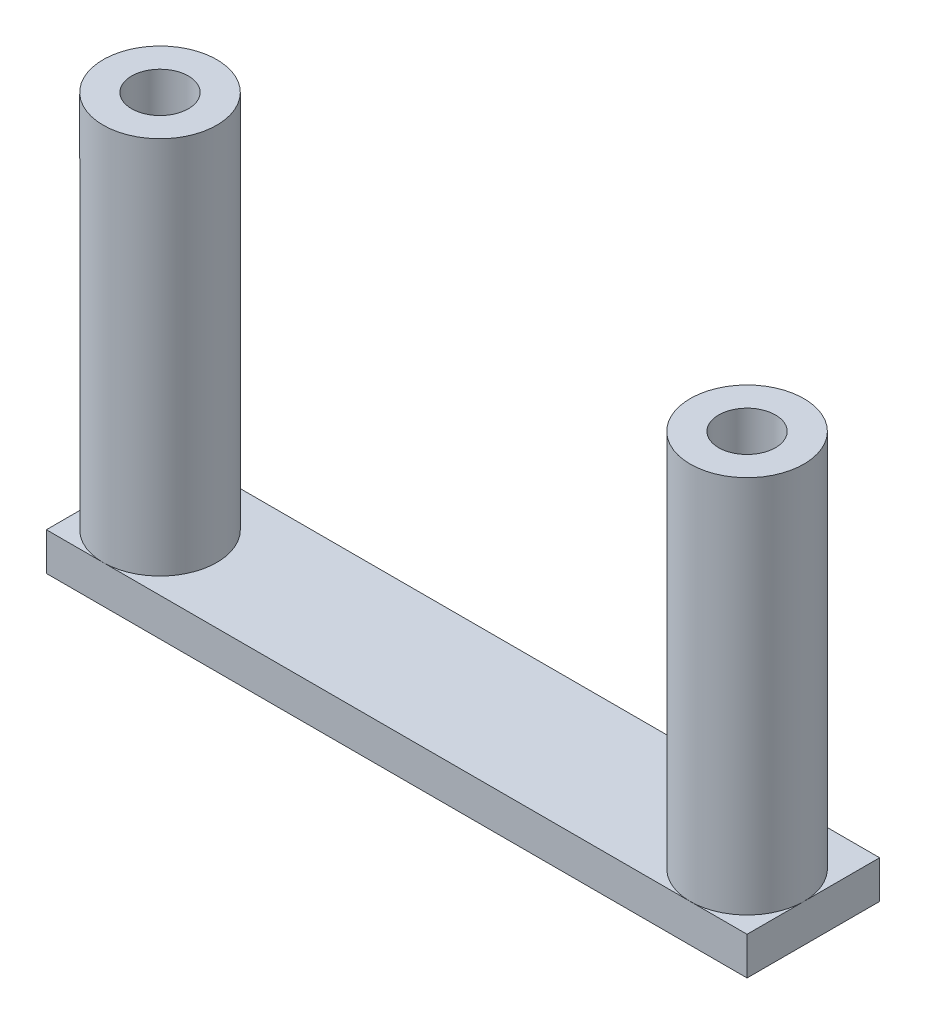
ISO-10303-21;
HEADER;
FILE_DESCRIPTION(('STEP AP214'),'2;1');
FILE_NAME('part.step','',(''),(''),'','','');
FILE_SCHEMA(('AUTOMOTIVE_DESIGN { 1 0 10303 214 1 1 1 1 }'));
ENDSEC;
DATA;
#1=APPLICATION_CONTEXT('core data for automotive mechanical design processes');
#2=APPLICATION_PROTOCOL_DEFINITION('international standard','automotive_design',2000,#1);
#3=PRODUCT_CONTEXT('',#1,'mechanical');
#4=PRODUCT('Part','Part','',(#3));
#5=PRODUCT_RELATED_PRODUCT_CATEGORY('part','',(#4));
#6=PRODUCT_DEFINITION_FORMATION('','',#4);
#7=PRODUCT_DEFINITION_CONTEXT('part definition',#1,'design');
#8=PRODUCT_DEFINITION('design','',#6,#7);
#9=PRODUCT_DEFINITION_SHAPE('','',#8);
#10=(LENGTH_UNIT() NAMED_UNIT(*) SI_UNIT(.MILLI.,.METRE.));
#11=(NAMED_UNIT(*) PLANE_ANGLE_UNIT() SI_UNIT($,.RADIAN.));
#12=(NAMED_UNIT(*) SI_UNIT($,.STERADIAN.) SOLID_ANGLE_UNIT());
#13=UNCERTAINTY_MEASURE_WITH_UNIT(LENGTH_MEASURE(1.E-05),#10,'distance_accuracy_value','');
#14=(GEOMETRIC_REPRESENTATION_CONTEXT(3) GLOBAL_UNCERTAINTY_ASSIGNED_CONTEXT((#13)) GLOBAL_UNIT_ASSIGNED_CONTEXT((#10,
#11,#12)) REPRESENTATION_CONTEXT('',''));
#15=CARTESIAN_POINT('',(0.,0.,0.));
#16=DIRECTION('',(0.,0.,1.));
#17=DIRECTION('',(1.,0.,0.));
#18=AXIS2_PLACEMENT_3D('',#15,#16,#17);
#19=CARTESIAN_POINT('',(0.,2.,0.));
#20=DIRECTION('',(0.,1.,0.));
#21=DIRECTION('',(0.,0.,1.));
#22=AXIS2_PLACEMENT_3D('',#19,#20,#21);
#23=PLANE('',#22);
#24=DIRECTION('',(1.,0.,0.));
#25=VECTOR('',#24,1.);
#26=CARTESIAN_POINT('',(0.,2.,3.));
#27=LINE('',#26,#25);
#28=CARTESIAN_POINT('',(-3.,2.,3.));
#29=VERTEX_POINT('',#28);
#30=CARTESIAN_POINT('',(0.,2.,3.));
#31=VERTEX_POINT('',#30);
#32=EDGE_CURVE('E129',#29,#31,#27,.T.);
#33=ORIENTED_EDGE('',*,*,#32,.T.);
#34=CARTESIAN_POINT('',(0.,2.,0.));
#35=DIRECTION('',(0.,1.,0.));
#36=DIRECTION('',(0.,0.,1.));
#37=AXIS2_PLACEMENT_3D('',#34,#35,#36);
#38=CIRCLE('',#37,3.);
#39=CARTESIAN_POINT('',(-3.,2.,0.));
#40=VERTEX_POINT('',#39);
#41=EDGE_CURVE('E59',#40,#31,#38,.T.);
#42=ORIENTED_EDGE('',*,*,#41,.F.);
#43=DIRECTION('',(0.,0.,-1.));
#44=VECTOR('',#43,1.);
#45=CARTESIAN_POINT('',(-3.,2.,0.));
#46=LINE('',#45,#44);
#47=EDGE_CURVE('E146',#29,#40,#46,.T.);
#48=ORIENTED_EDGE('',*,*,#47,.F.);
#49=EDGE_LOOP('',(#33,#42,#48));
#50=FACE_BOUND('',#49,.T.);
#51=ADVANCED_FACE('F37',(#50),#23,.T.);
#52=DIRECTION('',(1.,0.,0.));
#53=VECTOR('',#52,1.);
#54=CARTESIAN_POINT('',(0.,2.,-4.));
#55=LINE('',#54,#53);
#56=CARTESIAN_POINT('',(-3.,2.,-4.));
#57=VERTEX_POINT('',#56);
#58=CARTESIAN_POINT('',(34.,2.,-4.));
#59=VERTEX_POINT('',#58);
#60=EDGE_CURVE('E103',#57,#59,#55,.T.);
#61=ORIENTED_EDGE('',*,*,#60,.F.);
#62=EDGE_CURVE('E102',#40,#57,#46,.T.);
#63=ORIENTED_EDGE('',*,*,#62,.F.);
#64=EDGE_CURVE('E162',#31,#40,#38,.T.);
#65=ORIENTED_EDGE('',*,*,#64,.F.);
#66=CARTESIAN_POINT('',(31.,2.,3.));
#67=VERTEX_POINT('',#66);
#68=EDGE_CURVE('E149',#31,#67,#27,.T.);
#69=ORIENTED_EDGE('',*,*,#68,.T.);
#70=CARTESIAN_POINT('',(31.,2.,0.));
#71=DIRECTION('',(0.,1.,0.));
#72=DIRECTION('',(0.,0.,1.));
#73=AXIS2_PLACEMENT_3D('',#70,#71,#72);
#74=CIRCLE('',#73,3.);
#75=CARTESIAN_POINT('',(34.,2.,0.));
#76=VERTEX_POINT('',#75);
#77=EDGE_CURVE('E141',#76,#67,#74,.T.);
#78=ORIENTED_EDGE('',*,*,#77,.F.);
#79=DIRECTION('',(0.,0.,-1.));
#80=VECTOR('',#79,1.);
#81=CARTESIAN_POINT('',(34.,2.,0.));
#82=LINE('',#81,#80);
#83=EDGE_CURVE('E124',#76,#59,#82,.T.);
#84=ORIENTED_EDGE('',*,*,#83,.T.);
#85=EDGE_LOOP('',(#61,#63,#65,#69,#78,#84));
#86=FACE_BOUND('',#85,.T.);
#87=ADVANCED_FACE('F160',(#86),#23,.T.);
#88=CARTESIAN_POINT('',(34.,2.,3.));
#89=VERTEX_POINT('',#88);
#90=EDGE_CURVE('E119',#89,#76,#82,.T.);
#91=ORIENTED_EDGE('',*,*,#90,.T.);
#92=EDGE_CURVE('E137',#67,#76,#74,.T.);
#93=ORIENTED_EDGE('',*,*,#92,.F.);
#94=EDGE_CURVE('E147',#67,#89,#27,.T.);
#95=ORIENTED_EDGE('',*,*,#94,.T.);
#96=EDGE_LOOP('',(#91,#93,#95));
#97=FACE_BOUND('',#96,.T.);
#98=ADVANCED_FACE('F165',(#97),#23,.T.);
#99=CARTESIAN_POINT('',(-3.,2.,0.));
#100=DIRECTION('',(-1.,0.,0.));
#101=DIRECTION('',(0.,0.,1.));
#102=AXIS2_PLACEMENT_3D('',#99,#100,#101);
#103=PLANE('',#102);
#104=DIRECTION('',(0.,-1.,0.));
#105=VECTOR('',#104,1.);
#106=CARTESIAN_POINT('',(-3.,22.,-4.));
#107=LINE('',#106,#105);
#108=CARTESIAN_POINT('',(-3.,0.,-4.));
#109=VERTEX_POINT('',#108);
#110=EDGE_CURVE('E89',#57,#109,#107,.T.);
#111=ORIENTED_EDGE('',*,*,#110,.T.);
#112=DIRECTION('',(0.,0.,-1.));
#113=VECTOR('',#112,1.);
#114=CARTESIAN_POINT('',(-3.,0.,0.));
#115=LINE('',#114,#113);
#116=CARTESIAN_POINT('',(-3.,0.,3.));
#117=VERTEX_POINT('',#116);
#118=EDGE_CURVE('E99',#117,#109,#115,.T.);
#119=ORIENTED_EDGE('',*,*,#118,.F.);
#120=DIRECTION('',(0.,-1.,0.));
#121=VECTOR('',#120,1.);
#122=CARTESIAN_POINT('',(-3.,2.,3.));
#123=LINE('',#122,#121);
#124=EDGE_CURVE('E11',#29,#117,#123,.T.);
#125=ORIENTED_EDGE('',*,*,#124,.F.);
#126=ORIENTED_EDGE('',*,*,#47,.T.);
#127=ORIENTED_EDGE('',*,*,#62,.T.);
#128=EDGE_LOOP('',(#111,#119,#125,#126,#127));
#129=FACE_BOUND('',#128,.T.);
#130=ADVANCED_FACE('F98',(#129),#103,.T.);
#131=CARTESIAN_POINT('',(0.,2.,3.));
#132=DIRECTION('',(0.,0.,-1.));
#133=DIRECTION('',(-1.,0.,0.));
#134=AXIS2_PLACEMENT_3D('',#131,#132,#133);
#135=PLANE('',#134);
#136=DIRECTION('',(1.,0.,0.));
#137=VECTOR('',#136,1.);
#138=CARTESIAN_POINT('',(0.,0.,3.));
#139=LINE('',#138,#137);
#140=CARTESIAN_POINT('',(34.,0.,3.));
#141=VERTEX_POINT('',#140);
#142=EDGE_CURVE('E108',#117,#141,#139,.T.);
#143=ORIENTED_EDGE('',*,*,#142,.T.);
#144=DIRECTION('',(0.,-1.,0.));
#145=VECTOR('',#144,1.);
#146=CARTESIAN_POINT('',(34.,2.,3.));
#147=LINE('',#146,#145);
#148=EDGE_CURVE('E45',#89,#141,#147,.T.);
#149=ORIENTED_EDGE('',*,*,#148,.F.);
#150=ORIENTED_EDGE('',*,*,#94,.F.);
#151=ORIENTED_EDGE('',*,*,#68,.F.);
#152=ORIENTED_EDGE('',*,*,#32,.F.);
#153=ORIENTED_EDGE('',*,*,#124,.T.);
#154=EDGE_LOOP('',(#143,#149,#150,#151,#152,#153));
#155=FACE_BOUND('',#154,.T.);
#156=ADVANCED_FACE('F156',(#155),#135,.F.);
#157=CARTESIAN_POINT('',(34.,2.,0.));
#158=DIRECTION('',(-1.,0.,0.));
#159=DIRECTION('',(0.,0.,1.));
#160=AXIS2_PLACEMENT_3D('',#157,#158,#159);
#161=PLANE('',#160);
#162=DIRECTION('',(0.,0.,-1.));
#163=VECTOR('',#162,1.);
#164=CARTESIAN_POINT('',(34.,0.,0.));
#165=LINE('',#164,#163);
#166=CARTESIAN_POINT('',(34.,0.,-4.));
#167=VERTEX_POINT('',#166);
#168=EDGE_CURVE('E111',#141,#167,#165,.T.);
#169=ORIENTED_EDGE('',*,*,#168,.T.);
#170=DIRECTION('',(0.,-1.,0.));
#171=VECTOR('',#170,1.);
#172=CARTESIAN_POINT('',(34.,22.,-4.));
#173=LINE('',#172,#171);
#174=EDGE_CURVE('E52',#59,#167,#173,.T.);
#175=ORIENTED_EDGE('',*,*,#174,.F.);
#176=ORIENTED_EDGE('',*,*,#83,.F.);
#177=ORIENTED_EDGE('',*,*,#90,.F.);
#178=ORIENTED_EDGE('',*,*,#148,.T.);
#179=EDGE_LOOP('',(#169,#175,#176,#177,#178));
#180=FACE_BOUND('',#179,.T.);
#181=ADVANCED_FACE('F203',(#180),#161,.F.);
#182=CARTESIAN_POINT('',(31.,2.,0.));
#183=DIRECTION('',(0.,-1.,0.));
#184=DIRECTION('',(0.,0.,-1.));
#185=AXIS2_PLACEMENT_3D('',#182,#183,#184);
#186=CYLINDRICAL_SURFACE('',#185,1.5);
#187=CARTESIAN_POINT('',(31.,0.,0.));
#188=DIRECTION('',(0.,1.,0.));
#189=DIRECTION('',(0.,0.,1.));
#190=AXIS2_PLACEMENT_3D('',#187,#188,#189);
#191=CIRCLE('',#190,1.5);
#192=CARTESIAN_POINT('',(31.,0.,1.5));
#193=VERTEX_POINT('',#192);
#194=EDGE_CURVE('E109',#193,#193,#191,.T.);
#195=ORIENTED_EDGE('',*,*,#194,.F.);
#196=EDGE_LOOP('',(#195));
#197=FACE_BOUND('',#196,.T.);
#198=CARTESIAN_POINT('',(31.,22.,0.));
#199=DIRECTION('',(0.,1.,0.));
#200=DIRECTION('',(0.,0.,1.));
#201=AXIS2_PLACEMENT_3D('',#198,#199,#200);
#202=CIRCLE('',#201,1.5);
#203=CARTESIAN_POINT('',(31.,22.,1.5));
#204=VERTEX_POINT('',#203);
#205=EDGE_CURVE('E144',#204,#204,#202,.T.);
#206=ORIENTED_EDGE('',*,*,#205,.T.);
#207=EDGE_LOOP('',(#206));
#208=FACE_BOUND('',#207,.T.);
#209=ADVANCED_FACE('F208',(#197,#208),#186,.F.);
#210=CARTESIAN_POINT('',(0.,2.,0.));
#211=DIRECTION('',(0.,-1.,0.));
#212=DIRECTION('',(0.,0.,-1.));
#213=AXIS2_PLACEMENT_3D('',#210,#211,#212);
#214=CYLINDRICAL_SURFACE('',#213,1.5);
#215=CARTESIAN_POINT('',(0.,0.,0.));
#216=DIRECTION('',(0.,1.,0.));
#217=DIRECTION('',(0.,0.,1.));
#218=AXIS2_PLACEMENT_3D('',#215,#216,#217);
#219=CIRCLE('',#218,1.5);
#220=CARTESIAN_POINT('',(0.,0.,1.5));
#221=VERTEX_POINT('',#220);
#222=EDGE_CURVE('E114',#221,#221,#219,.T.);
#223=ORIENTED_EDGE('',*,*,#222,.F.);
#224=EDGE_LOOP('',(#223));
#225=FACE_BOUND('',#224,.T.);
#226=CARTESIAN_POINT('',(0.,22.,0.));
#227=DIRECTION('',(0.,1.,0.));
#228=DIRECTION('',(0.,0.,1.));
#229=AXIS2_PLACEMENT_3D('',#226,#227,#228);
#230=CIRCLE('',#229,1.5);
#231=CARTESIAN_POINT('',(0.,22.,1.5));
#232=VERTEX_POINT('',#231);
#233=EDGE_CURVE('E306',#232,#232,#230,.T.);
#234=ORIENTED_EDGE('',*,*,#233,.T.);
#235=EDGE_LOOP('',(#234));
#236=FACE_BOUND('',#235,.T.);
#237=ADVANCED_FACE('F39',(#225,#236),#214,.F.);
#238=CARTESIAN_POINT('',(0.,0.,0.));
#239=DIRECTION('',(0.,1.,0.));
#240=DIRECTION('',(0.,0.,1.));
#241=AXIS2_PLACEMENT_3D('',#238,#239,#240);
#242=PLANE('',#241);
#243=ORIENTED_EDGE('',*,*,#222,.T.);
#244=EDGE_LOOP('',(#243));
#245=FACE_BOUND('',#244,.T.);
#246=ORIENTED_EDGE('',*,*,#194,.T.);
#247=EDGE_LOOP('',(#246));
#248=FACE_BOUND('',#247,.T.);
#249=ORIENTED_EDGE('',*,*,#118,.T.);
#250=DIRECTION('',(-1.,0.,0.));
#251=VECTOR('',#250,1.);
#252=CARTESIAN_POINT('',(34.,0.,-4.));
#253=LINE('',#252,#251);
#254=EDGE_CURVE('E86',#167,#109,#253,.T.);
#255=ORIENTED_EDGE('',*,*,#254,.F.);
#256=ORIENTED_EDGE('',*,*,#168,.F.);
#257=ORIENTED_EDGE('',*,*,#142,.F.);
#258=EDGE_LOOP('',(#249,#255,#256,#257));
#259=FACE_BOUND('',#258,.T.);
#260=ADVANCED_FACE('F106',(#245,#248,#259),#242,.F.);
#261=CARTESIAN_POINT('',(31.,22.,0.));
#262=DIRECTION('',(0.,1.,0.));
#263=DIRECTION('',(0.,0.,1.));
#264=AXIS2_PLACEMENT_3D('',#261,#262,#263);
#265=PLANE('',#264);
#266=CARTESIAN_POINT('',(31.,22.,0.));
#267=DIRECTION('',(0.,1.,0.));
#268=DIRECTION('',(0.,0.,1.));
#269=AXIS2_PLACEMENT_3D('',#266,#267,#268);
#270=CIRCLE('',#269,3.);
#271=CARTESIAN_POINT('',(31.,22.,3.));
#272=VERTEX_POINT('',#271);
#273=EDGE_CURVE('E133',#272,#272,#270,.T.);
#274=ORIENTED_EDGE('',*,*,#273,.T.);
#275=EDGE_LOOP('',(#274));
#276=FACE_BOUND('',#275,.T.);
#277=ORIENTED_EDGE('',*,*,#205,.F.);
#278=EDGE_LOOP('',(#277));
#279=FACE_BOUND('',#278,.T.);
#280=ADVANCED_FACE('F219',(#276,#279),#265,.T.);
#281=CARTESIAN_POINT('',(31.,22.,0.));
#282=DIRECTION('',(0.,-1.,0.));
#283=DIRECTION('',(0.,0.,-1.));
#284=AXIS2_PLACEMENT_3D('',#281,#282,#283);
#285=CYLINDRICAL_SURFACE('',#284,3.);
#286=ORIENTED_EDGE('',*,*,#273,.F.);
#287=EDGE_LOOP('',(#286));
#288=FACE_BOUND('',#287,.T.);
#289=ORIENTED_EDGE('',*,*,#92,.T.);
#290=ORIENTED_EDGE('',*,*,#77,.T.);
#291=EDGE_LOOP('',(#289,#290));
#292=FACE_BOUND('',#291,.T.);
#293=ADVANCED_FACE('F164',(#288,#292),#285,.T.);
#294=CARTESIAN_POINT('',(0.,22.,0.));
#295=DIRECTION('',(0.,1.,0.));
#296=DIRECTION('',(0.,0.,1.));
#297=AXIS2_PLACEMENT_3D('',#294,#295,#296);
#298=PLANE('',#297);
#299=CARTESIAN_POINT('',(0.,22.,0.));
#300=DIRECTION('',(0.,1.,0.));
#301=DIRECTION('',(0.,0.,1.));
#302=AXIS2_PLACEMENT_3D('',#299,#300,#301);
#303=CIRCLE('',#302,3.);
#304=CARTESIAN_POINT('',(0.,22.,3.));
#305=VERTEX_POINT('',#304);
#306=EDGE_CURVE('E301',#305,#305,#303,.T.);
#307=ORIENTED_EDGE('',*,*,#306,.T.);
#308=EDGE_LOOP('',(#307));
#309=FACE_BOUND('',#308,.T.);
#310=ORIENTED_EDGE('',*,*,#233,.F.);
#311=EDGE_LOOP('',(#310));
#312=FACE_BOUND('',#311,.T.);
#313=ADVANCED_FACE('F236',(#309,#312),#298,.T.);
#314=CARTESIAN_POINT('',(0.,22.,0.));
#315=DIRECTION('',(0.,-1.,0.));
#316=DIRECTION('',(0.,0.,-1.));
#317=AXIS2_PLACEMENT_3D('',#314,#315,#316);
#318=CYLINDRICAL_SURFACE('',#317,3.);
#319=ORIENTED_EDGE('',*,*,#306,.F.);
#320=EDGE_LOOP('',(#319));
#321=FACE_BOUND('',#320,.T.);
#322=ORIENTED_EDGE('',*,*,#64,.T.);
#323=ORIENTED_EDGE('',*,*,#41,.T.);
#324=EDGE_LOOP('',(#322,#323));
#325=FACE_BOUND('',#324,.T.);
#326=ADVANCED_FACE('F190',(#321,#325),#318,.T.);
#327=CARTESIAN_POINT('',(34.,22.,-4.));
#328=DIRECTION('',(0.,0.,1.));
#329=DIRECTION('',(1.,0.,0.));
#330=AXIS2_PLACEMENT_3D('',#327,#328,#329);
#331=PLANE('',#330);
#332=ORIENTED_EDGE('',*,*,#60,.T.);
#333=ORIENTED_EDGE('',*,*,#174,.T.);
#334=ORIENTED_EDGE('',*,*,#254,.T.);
#335=ORIENTED_EDGE('',*,*,#110,.F.);
#336=EDGE_LOOP('',(#332,#333,#334,#335));
#337=FACE_BOUND('',#336,.T.);
#338=ADVANCED_FACE('F88',(#337),#331,.F.);
#339=CLOSED_SHELL('',(#51,#87,#98,#130,#156,#181,#209,#237,#260,#280,#293,#313,#326,#338));
#340=MANIFOLD_SOLID_BREP('B2',#339);
#341=ADVANCED_BREP_SHAPE_REPRESENTATION('',(#18,#340),#14);
#342=SHAPE_DEFINITION_REPRESENTATION(#9,#341);
ENDSEC;
END-ISO-10303-21;
